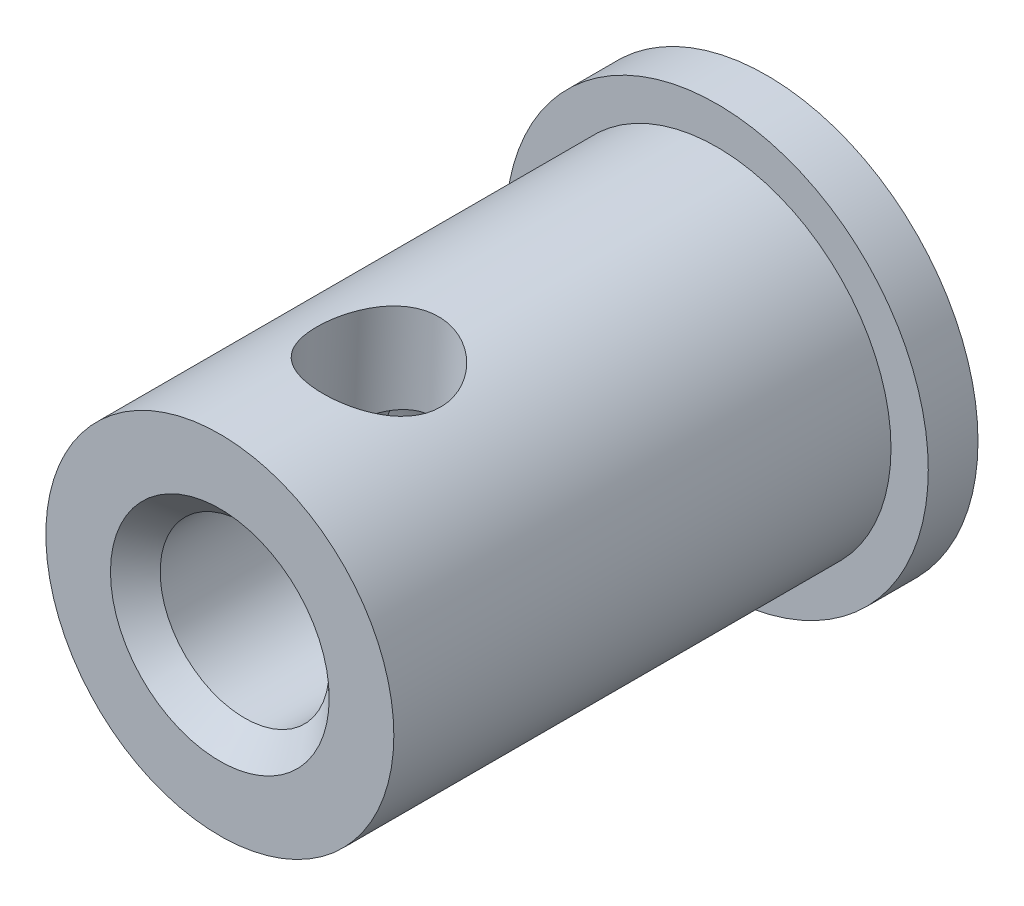
ISO-10303-21;
HEADER;
FILE_DESCRIPTION(('STEP AP214'),'2;1');
FILE_NAME('part.step','',(''),(''),'','','');
FILE_SCHEMA(('AUTOMOTIVE_DESIGN { 1 0 10303 214 1 1 1 1 }'));
ENDSEC;
DATA;
#1=APPLICATION_CONTEXT('core data for automotive mechanical design processes');
#2=APPLICATION_PROTOCOL_DEFINITION('international standard','automotive_design',2000,#1);
#3=PRODUCT_CONTEXT('',#1,'mechanical');
#4=PRODUCT('Part','Part','',(#3));
#5=PRODUCT_RELATED_PRODUCT_CATEGORY('part','',(#4));
#6=PRODUCT_DEFINITION_FORMATION('','',#4);
#7=PRODUCT_DEFINITION_CONTEXT('part definition',#1,'design');
#8=PRODUCT_DEFINITION('design','',#6,#7);
#9=PRODUCT_DEFINITION_SHAPE('','',#8);
#10=(LENGTH_UNIT() NAMED_UNIT(*) SI_UNIT(.MILLI.,.METRE.));
#11=(NAMED_UNIT(*) PLANE_ANGLE_UNIT() SI_UNIT($,.RADIAN.));
#12=(NAMED_UNIT(*) SI_UNIT($,.STERADIAN.) SOLID_ANGLE_UNIT());
#13=UNCERTAINTY_MEASURE_WITH_UNIT(LENGTH_MEASURE(1.E-05),#10,'distance_accuracy_value','');
#14=(GEOMETRIC_REPRESENTATION_CONTEXT(3) GLOBAL_UNCERTAINTY_ASSIGNED_CONTEXT((#13)) GLOBAL_UNIT_ASSIGNED_CONTEXT((#10,
#11,#12)) REPRESENTATION_CONTEXT('',''));
#15=CARTESIAN_POINT('',(0.,0.,0.));
#16=DIRECTION('',(0.,0.,1.));
#17=DIRECTION('',(1.,0.,0.));
#18=AXIS2_PLACEMENT_3D('',#15,#16,#17);
#19=CARTESIAN_POINT('',(0.,0.,1.));
#20=DIRECTION('',(0.,0.,-1.));
#21=DIRECTION('',(-1.,0.,0.));
#22=AXIS2_PLACEMENT_3D('',#19,#20,#21);
#23=CYLINDRICAL_SURFACE('',#22,4.25);
#24=CARTESIAN_POINT('',(0.,0.,1.));
#25=DIRECTION('',(0.,0.,1.));
#26=DIRECTION('',(1.,0.,0.));
#27=AXIS2_PLACEMENT_3D('',#24,#25,#26);
#28=CIRCLE('',#27,4.25);
#29=CARTESIAN_POINT('',(4.25,0.,1.));
#30=VERTEX_POINT('',#29);
#31=EDGE_CURVE('E80',#30,#30,#28,.T.);
#32=ORIENTED_EDGE('',*,*,#31,.F.);
#33=EDGE_LOOP('',(#32));
#34=FACE_BOUND('',#33,.T.);
#35=CARTESIAN_POINT('',(0.,0.,0.));
#36=DIRECTION('',(0.,0.,1.));
#37=DIRECTION('',(1.,0.,0.));
#38=AXIS2_PLACEMENT_3D('',#35,#36,#37);
#39=CIRCLE('',#38,4.25);
#40=CARTESIAN_POINT('',(4.25,0.,0.));
#41=VERTEX_POINT('',#40);
#42=EDGE_CURVE('E67',#41,#41,#39,.T.);
#43=ORIENTED_EDGE('',*,*,#42,.T.);
#44=EDGE_LOOP('',(#43));
#45=FACE_BOUND('',#44,.T.);
#46=ADVANCED_FACE('F38',(#34,#45),#23,.T.);
#47=CARTESIAN_POINT('',(0.,0.,1.));
#48=DIRECTION('',(0.,0.,1.));
#49=DIRECTION('',(1.,0.,0.));
#50=AXIS2_PLACEMENT_3D('',#47,#48,#49);
#51=PLANE('',#50);
#52=CARTESIAN_POINT('',(0.,0.,1.));
#53=DIRECTION('',(0.,0.,1.));
#54=DIRECTION('',(1.,0.,0.));
#55=AXIS2_PLACEMENT_3D('',#52,#53,#54);
#56=CIRCLE('',#55,3.5);
#57=CARTESIAN_POINT('',(3.5,0.,1.));
#58=VERTEX_POINT('',#57);
#59=EDGE_CURVE('E76',#58,#58,#56,.T.);
#60=ORIENTED_EDGE('',*,*,#59,.F.);
#61=EDGE_LOOP('',(#60));
#62=FACE_BOUND('',#61,.T.);
#63=ORIENTED_EDGE('',*,*,#31,.T.);
#64=EDGE_LOOP('',(#63));
#65=FACE_BOUND('',#64,.T.);
#66=ADVANCED_FACE('F102',(#62,#65),#51,.T.);
#67=CARTESIAN_POINT('',(0.,0.,0.));
#68=DIRECTION('',(0.,0.,1.));
#69=DIRECTION('',(1.,0.,0.));
#70=AXIS2_PLACEMENT_3D('',#67,#68,#69);
#71=PLANE('',#70);
#72=ORIENTED_EDGE('',*,*,#42,.F.);
#73=EDGE_LOOP('',(#72));
#74=FACE_BOUND('',#73,.T.);
#75=ADVANCED_FACE('F107',(#74),#71,.F.);
#76=CARTESIAN_POINT('',(0.,0.,11.));
#77=DIRECTION('',(0.,0.,-1.));
#78=DIRECTION('',(-1.,0.,0.));
#79=AXIS2_PLACEMENT_3D('',#76,#77,#78);
#80=CYLINDRICAL_SURFACE('',#79,3.5);
#81=CARTESIAN_POINT('',(-1.05455472342383,3.33735139523912,8.));
#82=CARTESIAN_POINT('',(-1.05455626243879,3.33735020085657,7.93223646881701));
#83=CARTESIAN_POINT('',(-1.04890973152245,3.33915069771036,7.86448306822128));
#84=CARTESIAN_POINT('',(-1.02657504196716,3.34608400119008,7.73100354053551));
#85=CARTESIAN_POINT('',(-1.0098863379776,3.35121697239995,7.66527751374117));
#86=CARTESIAN_POINT('',(-0.966176178127988,3.36407728466463,7.53781262046205));
#87=CARTESIAN_POINT('',(-0.939177447212405,3.37179891536302,7.47606533157396));
#88=CARTESIAN_POINT('',(-0.875738526073542,3.38882827514862,7.35786956560526));
#89=CARTESIAN_POINT('',(-0.839295805209174,3.39813642913639,7.30142251432457));
#90=CARTESIAN_POINT('',(-0.756302255773868,3.41758579269755,7.19288940054369));
#91=CARTESIAN_POINT('',(-0.709399013952326,3.42774550300242,7.14107606896805));
#92=CARTESIAN_POINT('',(-0.607644390853125,3.44723789106999,7.04574657565947));
#93=CARTESIAN_POINT('',(-0.552791512491396,3.45657041252092,7.0022319803361));
#94=CARTESIAN_POINT('',(-0.434696905593975,3.4734273850292,6.92345545657363));
#95=CARTESIAN_POINT('',(-0.371250556895921,3.48088810865647,6.88848525378488));
#96=CARTESIAN_POINT('',(-0.239087187556409,3.49245311662428,6.82973247227306));
#97=CARTESIAN_POINT('',(-0.170371820703043,3.49655844944362,6.8059463997661));
#98=CARTESIAN_POINT('',(-0.0325370590660375,3.50050062926478,6.77117952559996));
#99=CARTESIAN_POINT('',(0.0364592658878446,3.50049960683221,6.75973021988224));
#100=CARTESIAN_POINT('',(0.175261402273655,3.49629782927358,6.74846580508615));
#101=CARTESIAN_POINT('',(0.245066968702114,3.49209831405942,6.7486472621734));
#102=CARTESIAN_POINT('',(0.380178794557014,3.47992269052291,6.76035559878231));
#103=CARTESIAN_POINT('',(0.445546273992092,3.47212478195345,6.77137225319108));
#104=CARTESIAN_POINT('',(0.573235938009673,3.4533414698802,6.80358642557157));
#105=CARTESIAN_POINT('',(0.635557909618812,3.44235584382992,6.82478465442487));
#106=CARTESIAN_POINT('',(0.756451187485066,3.41784178547137,6.87702345791291));
#107=CARTESIAN_POINT('',(0.814957642738083,3.40427985559362,6.90819788349761));
#108=CARTESIAN_POINT('',(0.925948371318512,3.37578255219584,6.97938957004896));
#109=CARTESIAN_POINT('',(0.978430802116992,3.36084676096479,7.0194095256478));
#110=CARTESIAN_POINT('',(1.07890776875546,3.32999516825193,7.10966538796732));
#111=CARTESIAN_POINT('',(1.12651172886616,3.31406970182948,7.16033345097224));
#112=CARTESIAN_POINT('',(1.21273257872382,3.28350076552135,7.2691717437094));
#113=CARTESIAN_POINT('',(1.25134762358004,3.26885755919159,7.32734350970569));
#114=CARTESIAN_POINT('',(1.31919413782401,3.24208059826716,7.45093882597788));
#115=CARTESIAN_POINT('',(1.34823898943342,3.22999822531764,7.51647653328192));
#116=CARTESIAN_POINT('',(1.39496204167725,3.21009867729381,7.65208972604739));
#117=CARTESIAN_POINT('',(1.41264586586832,3.20227939233855,7.72216294755289));
#118=CARTESIAN_POINT('',(1.43536031176874,3.19216046744673,7.86104194286793));
#119=CARTESIAN_POINT('',(1.44098875331046,3.18960031550337,7.92973090633461));
#120=CARTESIAN_POINT('',(1.44115557824293,3.18952533395286,8.06711668761275));
#121=CARTESIAN_POINT('',(1.43569637886025,3.19200940465017,8.13581350044805));
#122=CARTESIAN_POINT('',(1.41437085041543,3.20151212365847,8.26828688736255));
#123=CARTESIAN_POINT('',(1.39894535176851,3.20833851291416,8.33214937178817));
#124=CARTESIAN_POINT('',(1.35863971033275,3.22561242171934,8.45629495749711));
#125=CARTESIAN_POINT('',(1.33375774184904,3.23606064047601,8.51657736499969));
#126=CARTESIAN_POINT('',(1.2742158083967,3.25997468102534,8.63420008874396));
#127=CARTESIAN_POINT('',(1.23924339565371,3.27353351849204,8.69136296289127));
#128=CARTESIAN_POINT('',(1.16079484561169,3.30216541308181,8.79910386040154));
#129=CARTESIAN_POINT('',(1.11731585474073,3.31723897749964,8.84967966459128));
#130=CARTESIAN_POINT('',(1.02011484011998,3.34844908494125,8.94577134499811));
#131=CARTESIAN_POINT('',(0.965952785897558,3.3645975562597,8.99083969273136));
#132=CARTESIAN_POINT('',(0.850440752774974,3.39563280320087,9.07114634252535));
#133=CARTESIAN_POINT('',(0.789090894043238,3.41051959990957,9.10638480889246));
#134=CARTESIAN_POINT('',(0.661063480147136,3.43762266313322,9.16575011170408));
#135=CARTESIAN_POINT('',(0.594414862450765,3.44985223424785,9.18993300873033));
#136=CARTESIAN_POINT('',(0.457424198223813,3.47067047716267,9.22652342952858));
#137=CARTESIAN_POINT('',(0.387083720225189,3.47926068134279,9.23893591204424));
#138=CARTESIAN_POINT('',(0.248733885732741,3.49180452081746,9.25113648332217));
#139=CARTESIAN_POINT('',(0.180800505256031,3.49598116566753,9.25156305322446));
#140=CARTESIAN_POINT('',(0.0456420345100587,3.50035528825811,9.24139231150663));
#141=CARTESIAN_POINT('',(-0.0215831275172237,3.50055317308601,9.23079612779776));
#142=CARTESIAN_POINT('',(-0.152011857474847,3.49729409367009,9.19931993535221));
#143=CARTESIAN_POINT('',(-0.215269550439797,3.49391178021086,9.17865463831576));
#144=CARTESIAN_POINT('',(-0.337604339990732,3.4842205245873,9.12783345463454));
#145=CARTESIAN_POINT('',(-0.396680650673867,3.47791103392625,9.0976757896432));
#146=CARTESIAN_POINT('',(-0.511522990477741,3.46292259746898,9.02734432383809));
#147=CARTESIAN_POINT('',(-0.567061697705713,3.45415887854718,8.98681776245078));
#148=CARTESIAN_POINT('',(-0.67081461203372,3.43551907076678,8.89747377040415));
#149=CARTESIAN_POINT('',(-0.719026305164448,3.42564260212788,8.84865350620834));
#150=CARTESIAN_POINT('',(-0.809005087445361,3.40554505282377,8.74139058641294));
#151=CARTESIAN_POINT('',(-0.850366122230992,3.39532941546912,8.68260506129053));
#152=CARTESIAN_POINT('',(-0.922516948520562,3.37644181639502,8.55863079284462));
#153=CARTESIAN_POINT('',(-0.953307453179258,3.36776975055548,8.49344248187528));
#154=CARTESIAN_POINT('',(-1.00329361905194,3.35322067572763,8.35812953808137));
#155=CARTESIAN_POINT('',(-1.02244077852069,3.34735537998059,8.28798559681381));
#156=CARTESIAN_POINT('',(-1.04806732731541,3.33942233255504,8.14522305323119));
#157=CARTESIAN_POINT('',(-1.05455307443544,3.3373526749687,8.07260571155641));
#158=CARTESIAN_POINT('',(-1.05455472342383,3.33735139523912,8.));
#159=B_SPLINE_CURVE_WITH_KNOTS('',3,(#81,#82,#83,#84,#85,#86,#87,#88,#89,#90,#91,#92,#93,#94,
#95,#96,#97,#98,#99,#100,#101,#102,#103,#104,#105,#106,#107,#108,#109,#110,#111,#112,#113,#114,
#115,#116,#117,#118,#119,#120,#121,#122,#123,#124,#125,#126,#127,#128,#129,#130,#131,#132,#133,
#134,#135,#136,#137,#138,#139,#140,#141,#142,#143,#144,#145,#146,#147,#148,#149,#150,#151,#152,
#153,#154,#155,#156,#157,#158),.UNSPECIFIED.,.T.,.F.,(4,2,2,2,2,2,2,2,2,2,2,2,2,2,2,2,2,2,2,2,2,
2,2,2,2,2,2,2,2,2,2,2,2,2,2,2,2,2,4),(0.,0.203020883138165,0.406051793815671,0.60863775116282,
0.811278050310596,1.02220501259777,1.23317174861701,1.45056406841855,1.66788843235755,
1.8766323011199,2.08531454120126,2.28461868668642,2.48393674968961,2.6860498552956,
2.88822461610465,3.10122083881643,3.31426073854221,3.53123804647412,3.74810787062261,
3.95394726789477,4.15974179475174,4.3570047091319,4.55430572705357,4.75852942964241,
4.96282175786678,5.17866024153271,5.39449511724439,5.60922305543412,5.82386049090847,
6.02704135069306,6.23020142189365,6.42920732216896,6.62825052739449,6.83526508050383,
7.04235050272175,7.2591058108115,7.47584649234334,7.6934839563833,7.91101210793803),.UNSPECIFIED.);
#160=CARTESIAN_POINT('',(-1.05455472342383,3.33735139523912,8.));
#161=VERTEX_POINT('',#160);
#162=EDGE_CURVE('E11',#161,#161,#159,.T.);
#163=ORIENTED_EDGE('',*,*,#162,.T.);
#164=EDGE_LOOP('',(#163));
#165=FACE_BOUND('',#164,.T.);
#166=CARTESIAN_POINT('',(0.,0.,11.));
#167=DIRECTION('',(0.,0.,1.));
#168=DIRECTION('',(1.,0.,0.));
#169=AXIS2_PLACEMENT_3D('',#166,#167,#168);
#170=CIRCLE('',#169,3.5);
#171=CARTESIAN_POINT('',(3.5,0.,11.));
#172=VERTEX_POINT('',#171);
#173=EDGE_CURVE('E63',#172,#172,#170,.T.);
#174=ORIENTED_EDGE('',*,*,#173,.F.);
#175=EDGE_LOOP('',(#174));
#176=FACE_BOUND('',#175,.T.);
#177=ORIENTED_EDGE('',*,*,#59,.T.);
#178=EDGE_LOOP('',(#177));
#179=FACE_BOUND('',#178,.T.);
#180=ADVANCED_FACE('F114',(#165,#176,#179),#80,.T.);
#181=CARTESIAN_POINT('',(0.,0.,11.));
#182=DIRECTION('',(0.,0.,1.));
#183=DIRECTION('',(1.,0.,0.));
#184=AXIS2_PLACEMENT_3D('',#181,#182,#183);
#185=PLANE('',#184);
#186=CARTESIAN_POINT('',(0.,0.,11.));
#187=DIRECTION('',(0.,0.,1.));
#188=DIRECTION('',(1.,0.,0.));
#189=AXIS2_PLACEMENT_3D('',#186,#187,#188);
#190=CIRCLE('',#189,2.19999999999999);
#191=CARTESIAN_POINT('',(2.19999999999999,0.,11.));
#192=VERTEX_POINT('',#191);
#193=EDGE_CURVE('E50',#192,#192,#190,.F.);
#194=ORIENTED_EDGE('',*,*,#193,.T.);
#195=EDGE_LOOP('',(#194));
#196=FACE_BOUND('',#195,.T.);
#197=ORIENTED_EDGE('',*,*,#173,.T.);
#198=EDGE_LOOP('',(#197));
#199=FACE_BOUND('',#198,.T.);
#200=ADVANCED_FACE('F57',(#196,#199),#185,.T.);
#201=CARTESIAN_POINT('',(0.,0.,5.99999999999999));
#202=DIRECTION('',(0.,0.,1.));
#203=DIRECTION('',(1.,0.,0.));
#204=AXIS2_PLACEMENT_3D('',#201,#202,#203);
#205=CONICAL_SURFACE('',#204,1.69999999999999,1.02974425867665);
#206=CARTESIAN_POINT('',(0.,0.,4.97853694765315));
#207=VERTEX_POINT('',#206);
#208=VERTEX_LOOP('',#207);
#209=FACE_BOUND('',#208,.T.);
#210=CARTESIAN_POINT('',(0.,0.,5.99999999999999));
#211=DIRECTION('',(0.,0.,1.));
#212=DIRECTION('',(1.,0.,0.));
#213=AXIS2_PLACEMENT_3D('',#210,#211,#212);
#214=CIRCLE('',#213,1.69999999999999);
#215=CARTESIAN_POINT('',(1.69999999999999,0.,5.99999999999999));
#216=VERTEX_POINT('',#215);
#217=EDGE_CURVE('E61',#216,#216,#214,.T.);
#218=ORIENTED_EDGE('',*,*,#217,.T.);
#219=EDGE_LOOP('',(#218));
#220=FACE_BOUND('',#219,.T.);
#221=ADVANCED_FACE('F53',(#209,#220),#205,.F.);
#222=CARTESIAN_POINT('',(0.,0.,11.));
#223=DIRECTION('',(0.,0.,1.));
#224=DIRECTION('',(1.,0.,0.));
#225=AXIS2_PLACEMENT_3D('',#222,#223,#224);
#226=CYLINDRICAL_SURFACE('',#225,1.69999999999999);
#227=CARTESIAN_POINT('',(-1.17970259447934,1.22405138314479,8.));
#228=CARTESIAN_POINT('',(-1.17969414302005,1.22406606843675,8.05881000772719));
#229=CARTESIAN_POINT('',(-1.17523719216853,1.22840345838597,8.11768799148287));
#230=CARTESIAN_POINT('',(-1.15790340297963,1.24474329582687,8.23313822479919));
#231=CARTESIAN_POINT('',(-1.14500128963846,1.25676874992608,8.28970300968462));
#232=CARTESIAN_POINT('',(-1.11208043149525,1.28598218494468,8.39835609689459));
#233=CARTESIAN_POINT('',(-1.09215649388403,1.30310093950854,8.4504930786103));
#234=CARTESIAN_POINT('',(-1.04608084290378,1.34037046974561,8.55069657122835));
#235=CARTESIAN_POINT('',(-1.01992956204662,1.36052103481266,8.59876336450606));
#236=CARTESIAN_POINT('',(-0.956224047017243,1.40622185474682,8.69990037751074));
#237=CARTESIAN_POINT('',(-0.917436649257513,1.43204972347339,8.75206850086033));
#238=CARTESIAN_POINT('',(-0.832299643220605,1.48315574545802,8.8502420641481));
#239=CARTESIAN_POINT('',(-0.785939523339106,1.50843307844732,8.89623877362894));
#240=CARTESIAN_POINT('',(-0.676431108175388,1.56102704547288,8.98960307792311));
#241=CARTESIAN_POINT('',(-0.611768983495005,1.58779983656947,9.03553068620405));
#242=CARTESIAN_POINT('',(-0.473340918775602,1.63439454594494,9.11567905064986));
#243=CARTESIAN_POINT('',(-0.399595852372286,1.65423201373194,9.14992599146798));
#244=CARTESIAN_POINT('',(-0.267797586665649,1.67970006038924,9.19639901697639));
#245=CARTESIAN_POINT('',(-0.211446587088972,1.68778728617806,9.21213489597901));
#246=CARTESIAN_POINT('',(-0.0966138746908164,1.69822788947477,9.23577295980011));
#247=CARTESIAN_POINT('',(-0.0381340181110772,1.70058614627028,9.24368180739334));
#248=CARTESIAN_POINT('',(0.0794316822846557,1.69916303915184,9.25120878514064));
#249=CARTESIAN_POINT('',(0.138518640918729,1.6953669776819,9.25080704123291));
#250=CARTESIAN_POINT('',(0.255342944189035,1.6817431852724,9.24169070759944));
#251=CARTESIAN_POINT('',(0.313079949412599,1.67191395401466,9.23297404983652));
#252=CARTESIAN_POINT('',(0.423838192560522,1.64726583942756,9.20813951559815));
#253=CARTESIAN_POINT('',(0.476949893191984,1.63260990730126,9.19225778833081));
#254=CARTESIAN_POINT('',(0.579328667949236,1.59915054217554,9.15392387424173));
#255=CARTESIAN_POINT('',(0.62859493782037,1.58034624469394,9.1314703175905));
#256=CARTESIAN_POINT('',(0.727806314222842,1.53737846132486,9.07800571496889));
#257=CARTESIAN_POINT('',(0.777231558574816,1.51285318831588,9.04632559952274));
#258=CARTESIAN_POINT('',(0.870143316604955,1.4613956294956,8.97679337409478));
#259=CARTESIAN_POINT('',(0.913624252795965,1.43446112178543,8.93893553967862));
#260=CARTESIAN_POINT('',(1.00221337553528,1.37439143312772,8.84993961443644));
#261=CARTESIAN_POINT('',(1.04602987770537,1.34105897623859,8.79764740886411));
#262=CARTESIAN_POINT('',(1.12471263863822,1.27578586537079,8.68587899584331));
#263=CARTESIAN_POINT('',(1.15957655823737,1.24384557694928,8.62640091680074));
#264=CARTESIAN_POINT('',(1.21340491303381,1.19111562213092,8.5138179843501));
#265=CARTESIAN_POINT('',(1.23417193354697,1.16939513059972,8.46201594153101));
#266=CARTESIAN_POINT('',(1.26915132940889,1.13133793207411,8.3543988508698));
#267=CARTESIAN_POINT('',(1.28337848706712,1.11498910740617,8.2985931862368));
#268=CARTESIAN_POINT('',(1.30265784840366,1.09236739378241,8.19393569176579));
#269=CARTESIAN_POINT('',(1.30888145126466,1.08483035387841,8.14558046565775));
#270=CARTESIAN_POINT('',(1.3159616878053,1.07623384886001,8.04792278702993));
#271=CARTESIAN_POINT('',(1.31682366247778,1.07516793754791,7.9986213262414));
#272=CARTESIAN_POINT('',(1.31312781533373,1.07967665719317,7.90058081602519));
#273=CARTESIAN_POINT('',(1.30857393197422,1.08524646260727,7.85184138389757));
#274=CARTESIAN_POINT('',(1.29435796166326,1.10215966002218,7.75612058052053));
#275=CARTESIAN_POINT('',(1.28468771892713,1.11351226908094,7.70914214480599));
#276=CARTESIAN_POINT('',(1.25595107843156,1.1459571251794,7.59966829622732));
#277=CARTESIAN_POINT('',(1.23468177831496,1.16912533517585,7.5383762042396));
#278=CARTESIAN_POINT('',(1.18410865990086,1.22032079662911,7.42139478725721));
#279=CARTESIAN_POINT('',(1.15478861129091,1.24835782119581,7.36571709426641));
#280=CARTESIAN_POINT('',(1.08759784419572,1.30736225989752,7.25847745807867));
#281=CARTESIAN_POINT('',(1.04948272389586,1.33839487311876,7.20710515931536));
#282=CARTESIAN_POINT('',(0.965546834680675,1.4001550880139,7.11095366900843));
#283=CARTESIAN_POINT('',(0.919731870354602,1.43088290112089,7.06616955824677));
#284=CARTESIAN_POINT('',(0.821511368884342,1.4894035996261,6.9847248723118));
#285=CARTESIAN_POINT('',(0.769250309535093,1.51724172809737,6.94792403077755));
#286=CARTESIAN_POINT('',(0.65789800954203,1.56873424048845,6.88254105416552));
#287=CARTESIAN_POINT('',(0.598808110226792,1.5923894437215,6.85395730891001));
#288=CARTESIAN_POINT('',(0.474280655901923,1.63382826583749,6.80622783046699));
#289=CARTESIAN_POINT('',(0.40879176781956,1.65155832412176,6.78716745826789));
#290=CARTESIAN_POINT('',(0.273979800854654,1.67918078860822,6.76026522174362));
#291=CARTESIAN_POINT('',(0.204661688819065,1.68908310405373,6.7524091635591));
#292=CARTESIAN_POINT('',(0.0756348300598684,1.69935929270089,6.74883326809378));
#293=CARTESIAN_POINT('',(0.0160612582798822,1.70094943712132,6.75145511855888));
#294=CARTESIAN_POINT('',(-0.101962051612057,1.69796525052257,6.76503629709392));
#295=CARTESIAN_POINT('',(-0.160411778827085,1.6933908597619,6.77599570596402));
#296=CARTESIAN_POINT('',(-0.272756190944481,1.67890337012135,6.80514604786034));
#297=CARTESIAN_POINT('',(-0.32673627656908,1.66916242630095,6.82309909217479));
#298=CARTESIAN_POINT('',(-0.431060402783298,1.64531252363875,6.8654256468772));
#299=CARTESIAN_POINT('',(-0.481403864617203,1.63120287141313,6.8898001763658));
#300=CARTESIAN_POINT('',(-0.583952672156348,1.59758288141288,6.94765100890284));
#301=CARTESIAN_POINT('',(-0.635572947107872,1.57761266165298,6.98189261347416));
#302=CARTESIAN_POINT('',(-0.73283121694542,1.53485742772375,7.05660804919315));
#303=CARTESIAN_POINT('',(-0.778461682187932,1.51206893932405,7.09708958808968));
#304=CARTESIAN_POINT('',(-0.871587418620532,1.46071162158159,7.19201385777699));
#305=CARTESIAN_POINT('',(-0.91773162317265,1.43187820322054,7.24764199066097));
#306=CARTESIAN_POINT('',(-1.00027596044177,1.37547765502316,7.36633688969255));
#307=CARTESIAN_POINT('',(-1.03667978551954,1.34791004863795,7.42940082399565));
#308=CARTESIAN_POINT('',(-1.08976804094679,1.30507683127153,7.54394582166454));
#309=CARTESIAN_POINT('',(-1.10911931946077,1.28853033784751,7.59370797734005));
#310=CARTESIAN_POINT('',(-1.14127916309689,1.26013728290705,7.69652218734992));
#311=CARTESIAN_POINT('',(-1.1541074312034,1.24827659226017,7.74956378499881));
#312=CARTESIAN_POINT('',(-1.16866739960464,1.23461369436118,7.83588634303661));
#313=CARTESIAN_POINT('',(-1.17278994919125,1.23068268424569,7.86843994900796));
#314=CARTESIAN_POINT('',(-1.17831000785572,1.22539732238573,7.93398854267035));
#315=CARTESIAN_POINT('',(-1.17970733920083,1.22404313869637,7.96698355900791));
#316=CARTESIAN_POINT('',(-1.17970259447934,1.22405138314479,8.));
#317=B_SPLINE_CURVE_WITH_KNOTS('',3,(#227,#228,#229,#230,#231,#232,#233,#234,#235,#236,#237,
#238,#239,#240,#241,#242,#243,#244,#245,#246,#247,#248,#249,#250,#251,#252,#253,#254,#255,#256,
#257,#258,#259,#260,#261,#262,#263,#264,#265,#266,#267,#268,#269,#270,#271,#272,#273,#274,#275,
#276,#277,#278,#279,#280,#281,#282,#283,#284,#285,#286,#287,#288,#289,#290,#291,#292,#293,#294,
#295,#296,#297,#298,#299,#300,#301,#302,#303,#304,#305,#306,#307,#308,#309,#310,#311,#312,#313,
#314,#315,#316),.UNSPECIFIED.,.T.,.F.,(4,2,2,2,2,2,2,2,2,2,2,2,2,2,2,2,2,2,2,2,2,2,2,2,2,2,2,2,
2,2,2,2,2,2,2,2,2,2,2,2,2,2,2,2,4),(0.,0.176261103616073,0.353052155111911,0.527542300951746,
0.702020331342789,0.91114881100457,1.1205700854895,1.3702974737904,1.61946130890931,
1.79590184926873,1.97219206477282,2.14890391173297,2.32565972090202,2.49697317233992,
2.66832235774653,2.85849315665014,3.04884118396076,3.27575163132571,3.50272130649675,
3.68180598454365,3.86048385553266,4.00782961090052,4.15502856406631,4.30212053834978,
4.44944769567687,4.65498760640088,4.86094496715904,5.07351779042464,5.28593107692096,
5.49423934660937,5.70250676946912,5.91260889306199,6.12244461774985,6.30049046677244,
6.47853804127813,6.65099462261641,6.82347858961237,7.01801803675738,7.21279973938288,
7.44531359730311,7.67773918912362,7.84491067243299,8.01157416329928,8.11052220042986,
8.20947669051831),.UNSPECIFIED.);
#318=CARTESIAN_POINT('',(-1.17970259447934,1.22405138314479,8.));
#319=VERTEX_POINT('',#318);
#320=EDGE_CURVE('E64',#319,#319,#317,.T.);
#321=ORIENTED_EDGE('',*,*,#320,.T.);
#322=EDGE_LOOP('',(#321));
#323=FACE_BOUND('',#322,.T.);
#324=CARTESIAN_POINT('',(0.,0.,10.5));
#325=DIRECTION('',(0.,0.,1.));
#326=DIRECTION('',(1.,0.,0.));
#327=AXIS2_PLACEMENT_3D('',#324,#325,#326);
#328=CIRCLE('',#327,1.69999999999999);
#329=CARTESIAN_POINT('',(1.69999999999999,0.,10.5));
#330=VERTEX_POINT('',#329);
#331=EDGE_CURVE('E79',#330,#330,#328,.T.);
#332=ORIENTED_EDGE('',*,*,#331,.T.);
#333=EDGE_LOOP('',(#332));
#334=FACE_BOUND('',#333,.T.);
#335=ORIENTED_EDGE('',*,*,#217,.F.);
#336=EDGE_LOOP('',(#335));
#337=FACE_BOUND('',#336,.T.);
#338=ADVANCED_FACE('F56',(#323,#334,#337),#226,.F.);
#339=CARTESIAN_POINT('',(0.,0.,10.5));
#340=DIRECTION('',(0.,0.,1.));
#341=DIRECTION('',(1.,0.,0.));
#342=AXIS2_PLACEMENT_3D('',#339,#340,#341);
#343=CONICAL_SURFACE('',#342,1.69999999999999,0.785398163397449);
#344=ORIENTED_EDGE('',*,*,#193,.F.);
#345=EDGE_LOOP('',(#344));
#346=FACE_BOUND('',#345,.T.);
#347=ORIENTED_EDGE('',*,*,#331,.F.);
#348=EDGE_LOOP('',(#347));
#349=FACE_BOUND('',#348,.T.);
#350=ADVANCED_FACE('F40',(#346,#349),#343,.F.);
#351=CARTESIAN_POINT('',(0.206904611905834,3.49387900213675,8.));
#352=DIRECTION('',(0.0591156034016667,0.998251143467643,0.));
#353=DIRECTION('',(-0.998251143467643,0.0591156034016667,0.));
#354=AXIS2_PLACEMENT_3D('',#351,#352,#353);
#355=CYLINDRICAL_SURFACE('',#354,1.25);
#356=ORIENTED_EDGE('',*,*,#162,.F.);
#357=EDGE_LOOP('',(#356));
#358=FACE_BOUND('',#357,.T.);
#359=ORIENTED_EDGE('',*,*,#320,.F.);
#360=EDGE_LOOP('',(#359));
#361=FACE_BOUND('',#360,.T.);
#362=ADVANCED_FACE('F93',(#358,#361),#355,.F.);
#363=CLOSED_SHELL('',(#46,#66,#75,#180,#200,#221,#338,#350,#362));
#364=MANIFOLD_SOLID_BREP('B2',#363);
#365=ADVANCED_BREP_SHAPE_REPRESENTATION('',(#18,#364),#14);
#366=SHAPE_DEFINITION_REPRESENTATION(#9,#365);
ENDSEC;
END-ISO-10303-21;
